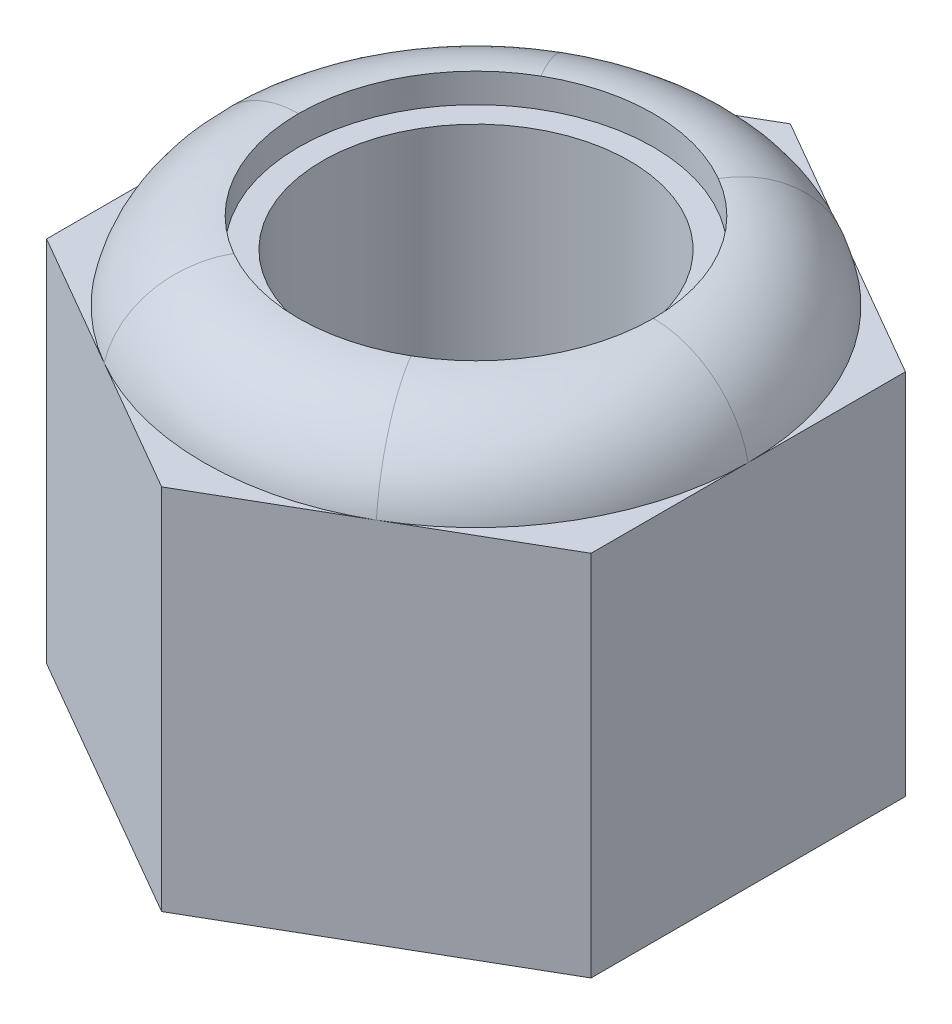
ISO-10303-21;
HEADER;
FILE_DESCRIPTION(('STEP AP214'),'2;1');
FILE_NAME('part.step','',(''),(''),'','','');
FILE_SCHEMA(('AUTOMOTIVE_DESIGN { 1 0 10303 214 1 1 1 1 }'));
ENDSEC;
DATA;
#1=APPLICATION_CONTEXT('core data for automotive mechanical design processes');
#2=APPLICATION_PROTOCOL_DEFINITION('international standard','automotive_design',2000,#1);
#3=PRODUCT_CONTEXT('',#1,'mechanical');
#4=PRODUCT('Part','Part','',(#3));
#5=PRODUCT_RELATED_PRODUCT_CATEGORY('part','',(#4));
#6=PRODUCT_DEFINITION_FORMATION('','',#4);
#7=PRODUCT_DEFINITION_CONTEXT('part definition',#1,'design');
#8=PRODUCT_DEFINITION('design','',#6,#7);
#9=PRODUCT_DEFINITION_SHAPE('','',#8);
#10=(LENGTH_UNIT() NAMED_UNIT(*) SI_UNIT(.MILLI.,.METRE.));
#11=(NAMED_UNIT(*) PLANE_ANGLE_UNIT() SI_UNIT($,.RADIAN.));
#12=(NAMED_UNIT(*) SI_UNIT($,.STERADIAN.) SOLID_ANGLE_UNIT());
#13=UNCERTAINTY_MEASURE_WITH_UNIT(LENGTH_MEASURE(1.E-05),#10,'distance_accuracy_value','');
#14=(GEOMETRIC_REPRESENTATION_CONTEXT(3) GLOBAL_UNCERTAINTY_ASSIGNED_CONTEXT((#13)) GLOBAL_UNIT_ASSIGNED_CONTEXT((#10,
#11,#12)) REPRESENTATION_CONTEXT('',''));
#15=CARTESIAN_POINT('',(0.,0.,0.));
#16=DIRECTION('',(0.,0.,1.));
#17=DIRECTION('',(1.,0.,0.));
#18=AXIS2_PLACEMENT_3D('',#15,#16,#17);
#19=CARTESIAN_POINT('',(0.,9.652,0.));
#20=DIRECTION('',(0.,-1.,0.));
#21=DIRECTION('',(0.,0.,-1.));
#22=AXIS2_PLACEMENT_3D('',#19,#20,#21);
#23=CYLINDRICAL_SURFACE('',#22,4.0291118051323);
#24=CARTESIAN_POINT('',(0.,0.,0.));
#25=DIRECTION('',(0.,1.,0.));
#26=DIRECTION('',(0.,0.,1.));
#27=AXIS2_PLACEMENT_3D('',#24,#25,#26);
#28=CIRCLE('',#27,4.0291118051323);
#29=CARTESIAN_POINT('',(0.,0.,4.0291118051323));
#30=VERTEX_POINT('',#29);
#31=EDGE_CURVE('E188',#30,#30,#28,.T.);
#32=ORIENTED_EDGE('',*,*,#31,.F.);
#33=EDGE_LOOP('',(#32));
#34=FACE_BOUND('',#33,.T.);
#35=CARTESIAN_POINT('',(0.,10.922,0.));
#36=DIRECTION('',(0.,1.,0.));
#37=DIRECTION('',(0.,0.,1.));
#38=AXIS2_PLACEMENT_3D('',#35,#36,#37);
#39=CIRCLE('',#38,4.0291118051323);
#40=CARTESIAN_POINT('',(0.,10.922,4.0291118051323));
#41=VERTEX_POINT('',#40);
#42=EDGE_CURVE('E45',#41,#41,#39,.T.);
#43=ORIENTED_EDGE('',*,*,#42,.T.);
#44=EDGE_LOOP('',(#43));
#45=FACE_BOUND('',#44,.T.);
#46=ADVANCED_FACE('F41',(#34,#45),#23,.F.);
#47=CARTESIAN_POINT('',(0.,9.652,0.));
#48=DIRECTION('',(0.,1.,0.));
#49=DIRECTION('',(0.,0.,1.));
#50=AXIS2_PLACEMENT_3D('',#47,#48,#49);
#51=PLANE('',#50);
#52=CARTESIAN_POINT('',(0.,9.652,0.));
#53=DIRECTION('',(0.,1.,0.));
#54=DIRECTION('',(0.,0.,1.));
#55=AXIS2_PLACEMENT_3D('',#52,#53,#54);
#56=CIRCLE('',#55,7.14375000000001);
#57=CARTESIAN_POINT('',(3.571875,9.652,6.1866689782851));
#58=VERTEX_POINT('',#57);
#59=CARTESIAN_POINT('',(7.14375,9.652,0.));
#60=VERTEX_POINT('',#59);
#61=EDGE_CURVE('E151',#58,#60,#56,.T.);
#62=ORIENTED_EDGE('',*,*,#61,.F.);
#63=DIRECTION('',(0.866025403784439,0.,-0.499999999999999));
#64=VECTOR('',#63,1.);
#65=CARTESIAN_POINT('',(3.571875,9.652,6.18666897828509));
#66=LINE('',#65,#64);
#67=CARTESIAN_POINT('',(7.14374999999999,9.652,4.1244459855234));
#68=VERTEX_POINT('',#67);
#69=EDGE_CURVE('E204',#58,#68,#66,.T.);
#70=ORIENTED_EDGE('',*,*,#69,.T.);
#71=DIRECTION('',(0.,0.,-1.));
#72=VECTOR('',#71,1.);
#73=CARTESIAN_POINT('',(7.14374999999999,9.652,4.1244459855234));
#74=LINE('',#73,#72);
#75=EDGE_CURVE('E208',#68,#60,#74,.T.);
#76=ORIENTED_EDGE('',*,*,#75,.T.);
#77=EDGE_LOOP('',(#62,#70,#76));
#78=FACE_BOUND('',#77,.T.);
#79=ADVANCED_FACE('F296',(#78),#51,.T.);
#80=CARTESIAN_POINT('',(3.571875,9.652,-6.18666897828509));
#81=VERTEX_POINT('',#80);
#82=EDGE_CURVE('E159',#60,#81,#56,.T.);
#83=ORIENTED_EDGE('',*,*,#82,.F.);
#84=CARTESIAN_POINT('',(7.14374999999999,9.652,-4.1244459855234));
#85=VERTEX_POINT('',#84);
#86=EDGE_CURVE('E207',#60,#85,#74,.T.);
#87=ORIENTED_EDGE('',*,*,#86,.T.);
#88=DIRECTION('',(-0.866025403784439,0.,-0.5));
#89=VECTOR('',#88,1.);
#90=CARTESIAN_POINT('',(0.,9.652,-8.24889197104679));
#91=LINE('',#90,#89);
#92=EDGE_CURVE('E212',#85,#81,#91,.T.);
#93=ORIENTED_EDGE('',*,*,#92,.T.);
#94=EDGE_LOOP('',(#83,#87,#93));
#95=FACE_BOUND('',#94,.T.);
#96=ADVANCED_FACE('F289',(#95),#51,.T.);
#97=CARTESIAN_POINT('',(-3.571875,9.652,-6.18666897828509));
#98=VERTEX_POINT('',#97);
#99=EDGE_CURVE('E184',#81,#98,#56,.T.);
#100=ORIENTED_EDGE('',*,*,#99,.F.);
#101=CARTESIAN_POINT('',(0.,9.652,-8.24889197104679));
#102=VERTEX_POINT('',#101);
#103=EDGE_CURVE('E211',#81,#102,#91,.T.);
#104=ORIENTED_EDGE('',*,*,#103,.T.);
#105=DIRECTION('',(-0.866025403784439,0.,0.5));
#106=VECTOR('',#105,1.);
#107=CARTESIAN_POINT('',(-3.571875,9.652,-6.18666897828509));
#108=LINE('',#107,#106);
#109=EDGE_CURVE('E193',#102,#98,#108,.T.);
#110=ORIENTED_EDGE('',*,*,#109,.T.);
#111=EDGE_LOOP('',(#100,#104,#110));
#112=FACE_BOUND('',#111,.T.);
#113=ADVANCED_FACE('F299',(#112),#51,.T.);
#114=CARTESIAN_POINT('',(-7.14375000000001,9.652,0.));
#115=VERTEX_POINT('',#114);
#116=EDGE_CURVE('E182',#98,#115,#56,.T.);
#117=ORIENTED_EDGE('',*,*,#116,.F.);
#118=CARTESIAN_POINT('',(-7.14375000000001,9.652,-4.12444598552339));
#119=VERTEX_POINT('',#118);
#120=EDGE_CURVE('E197',#98,#119,#108,.T.);
#121=ORIENTED_EDGE('',*,*,#120,.T.);
#122=DIRECTION('',(0.,0.,1.));
#123=VECTOR('',#122,1.);
#124=CARTESIAN_POINT('',(-7.14375000000001,9.652,-4.12444598552339));
#125=LINE('',#124,#123);
#126=EDGE_CURVE('E198',#119,#115,#125,.T.);
#127=ORIENTED_EDGE('',*,*,#126,.T.);
#128=EDGE_LOOP('',(#117,#121,#127));
#129=FACE_BOUND('',#128,.T.);
#130=ADVANCED_FACE('F276',(#129),#51,.T.);
#131=CARTESIAN_POINT('',(-3.57187500000001,9.652,6.18666897828509));
#132=VERTEX_POINT('',#131);
#133=EDGE_CURVE('E177',#115,#132,#56,.T.);
#134=ORIENTED_EDGE('',*,*,#133,.F.);
#135=CARTESIAN_POINT('',(-7.14375000000001,9.652,4.12444598552339));
#136=VERTEX_POINT('',#135);
#137=EDGE_CURVE('E196',#115,#136,#125,.T.);
#138=ORIENTED_EDGE('',*,*,#137,.T.);
#139=DIRECTION('',(0.866025403784438,0.,0.5));
#140=VECTOR('',#139,1.);
#141=CARTESIAN_POINT('',(0.,9.652,8.24889197104679));
#142=LINE('',#141,#140);
#143=EDGE_CURVE('E202',#136,#132,#142,.T.);
#144=ORIENTED_EDGE('',*,*,#143,.T.);
#145=EDGE_LOOP('',(#134,#138,#144));
#146=FACE_BOUND('',#145,.T.);
#147=ADVANCED_FACE('F274',(#146),#51,.T.);
#148=EDGE_CURVE('E147',#132,#58,#56,.T.);
#149=ORIENTED_EDGE('',*,*,#148,.F.);
#150=CARTESIAN_POINT('',(0.,9.652,8.24889197104679));
#151=VERTEX_POINT('',#150);
#152=EDGE_CURVE('E201',#132,#151,#142,.T.);
#153=ORIENTED_EDGE('',*,*,#152,.T.);
#154=EDGE_CURVE('E205',#151,#58,#66,.T.);
#155=ORIENTED_EDGE('',*,*,#154,.T.);
#156=EDGE_LOOP('',(#149,#153,#155));
#157=FACE_BOUND('',#156,.T.);
#158=ADVANCED_FACE('F273',(#157),#51,.T.);
#159=CARTESIAN_POINT('',(0.,0.,0.));
#160=DIRECTION('',(0.,1.,0.));
#161=DIRECTION('',(0.,0.,1.));
#162=AXIS2_PLACEMENT_3D('',#159,#160,#161);
#163=PLANE('',#162);
#164=DIRECTION('',(0.,0.,1.));
#165=VECTOR('',#164,1.);
#166=CARTESIAN_POINT('',(-7.14375000000001,0.,4.12444598552339));
#167=LINE('',#166,#165);
#168=CARTESIAN_POINT('',(-7.14375000000001,0.,-4.12444598552339));
#169=VERTEX_POINT('',#168);
#170=CARTESIAN_POINT('',(-7.14375000000001,0.,4.12444598552339));
#171=VERTEX_POINT('',#170);
#172=EDGE_CURVE('E192',#169,#171,#167,.T.);
#173=ORIENTED_EDGE('',*,*,#172,.F.);
#174=DIRECTION('',(-0.866025403784439,0.,0.5));
#175=VECTOR('',#174,1.);
#176=CARTESIAN_POINT('',(-3.571875,0.,-6.18666897828509));
#177=LINE('',#176,#175);
#178=CARTESIAN_POINT('',(0.,0.,-8.24889197104679));
#179=VERTEX_POINT('',#178);
#180=EDGE_CURVE('E227',#179,#169,#177,.T.);
#181=ORIENTED_EDGE('',*,*,#180,.F.);
#182=DIRECTION('',(-0.866025403784439,0.,-0.5));
#183=VECTOR('',#182,1.);
#184=CARTESIAN_POINT('',(0.,0.,-8.24889197104679));
#185=LINE('',#184,#183);
#186=CARTESIAN_POINT('',(7.14374999999999,0.,-4.1244459855234));
#187=VERTEX_POINT('',#186);
#188=EDGE_CURVE('E225',#187,#179,#185,.T.);
#189=ORIENTED_EDGE('',*,*,#188,.F.);
#190=DIRECTION('',(0.,0.,-1.));
#191=VECTOR('',#190,1.);
#192=CARTESIAN_POINT('',(7.14374999999999,0.,-4.1244459855234));
#193=LINE('',#192,#191);
#194=CARTESIAN_POINT('',(7.14374999999999,0.,4.1244459855234));
#195=VERTEX_POINT('',#194);
#196=EDGE_CURVE('E223',#195,#187,#193,.T.);
#197=ORIENTED_EDGE('',*,*,#196,.F.);
#198=DIRECTION('',(0.866025403784439,0.,-0.5));
#199=VECTOR('',#198,1.);
#200=CARTESIAN_POINT('',(3.571875,0.,6.18666897828509));
#201=LINE('',#200,#199);
#202=CARTESIAN_POINT('',(0.,0.,8.24889197104679));
#203=VERTEX_POINT('',#202);
#204=EDGE_CURVE('E220',#203,#195,#201,.T.);
#205=ORIENTED_EDGE('',*,*,#204,.F.);
#206=DIRECTION('',(0.866025403784438,0.,0.5));
#207=VECTOR('',#206,1.);
#208=CARTESIAN_POINT('',(0.,0.,8.24889197104679));
#209=LINE('',#208,#207);
#210=EDGE_CURVE('E217',#171,#203,#209,.T.);
#211=ORIENTED_EDGE('',*,*,#210,.F.);
#212=EDGE_LOOP('',(#173,#181,#189,#197,#205,#211));
#213=FACE_BOUND('',#212,.T.);
#214=ORIENTED_EDGE('',*,*,#31,.T.);
#215=EDGE_LOOP('',(#214));
#216=FACE_BOUND('',#215,.T.);
#217=ADVANCED_FACE('F258',(#213,#216),#163,.F.);
#218=CARTESIAN_POINT('',(-7.14375000000001,9.652,4.12444598552339));
#219=DIRECTION('',(1.,0.,0.));
#220=DIRECTION('',(0.,0.,-1.));
#221=AXIS2_PLACEMENT_3D('',#218,#219,#220);
#222=PLANE('',#221);
#223=ORIENTED_EDGE('',*,*,#172,.T.);
#224=DIRECTION('',(0.,-1.,0.));
#225=VECTOR('',#224,1.);
#226=CARTESIAN_POINT('',(-7.14375000000001,9.652,4.12444598552339));
#227=LINE('',#226,#225);
#228=EDGE_CURVE('E242',#136,#171,#227,.T.);
#229=ORIENTED_EDGE('',*,*,#228,.F.);
#230=ORIENTED_EDGE('',*,*,#137,.F.);
#231=ORIENTED_EDGE('',*,*,#126,.F.);
#232=DIRECTION('',(0.,-1.,0.));
#233=VECTOR('',#232,1.);
#234=CARTESIAN_POINT('',(-7.14375000000001,9.652,-4.12444598552339));
#235=LINE('',#234,#233);
#236=EDGE_CURVE('E185',#119,#169,#235,.T.);
#237=ORIENTED_EDGE('',*,*,#236,.T.);
#238=EDGE_LOOP('',(#223,#229,#230,#231,#237));
#239=FACE_BOUND('',#238,.T.);
#240=ADVANCED_FACE('F248',(#239),#222,.F.);
#241=CARTESIAN_POINT('',(0.,9.652,8.24889197104679));
#242=DIRECTION('',(0.5,0.,-0.866025403784438));
#243=DIRECTION('',(-0.866025403784439,0.,-0.5));
#244=AXIS2_PLACEMENT_3D('',#241,#242,#243);
#245=PLANE('',#244);
#246=ORIENTED_EDGE('',*,*,#210,.T.);
#247=DIRECTION('',(0.,-1.,0.));
#248=VECTOR('',#247,1.);
#249=CARTESIAN_POINT('',(0.,9.652,8.24889197104679));
#250=LINE('',#249,#248);
#251=EDGE_CURVE('E239',#151,#203,#250,.T.);
#252=ORIENTED_EDGE('',*,*,#251,.F.);
#253=ORIENTED_EDGE('',*,*,#152,.F.);
#254=ORIENTED_EDGE('',*,*,#143,.F.);
#255=ORIENTED_EDGE('',*,*,#228,.T.);
#256=EDGE_LOOP('',(#246,#252,#253,#254,#255));
#257=FACE_BOUND('',#256,.T.);
#258=ADVANCED_FACE('F263',(#257),#245,.F.);
#259=CARTESIAN_POINT('',(3.571875,9.652,6.18666897828509));
#260=DIRECTION('',(-0.5,0.,-0.866025403784439));
#261=DIRECTION('',(-0.866025403784439,0.,0.5));
#262=AXIS2_PLACEMENT_3D('',#259,#260,#261);
#263=PLANE('',#262);
#264=ORIENTED_EDGE('',*,*,#204,.T.);
#265=DIRECTION('',(0.,-1.,0.));
#266=VECTOR('',#265,1.);
#267=CARTESIAN_POINT('',(7.14374999999999,9.652,4.1244459855234));
#268=LINE('',#267,#266);
#269=EDGE_CURVE('E236',#68,#195,#268,.T.);
#270=ORIENTED_EDGE('',*,*,#269,.F.);
#271=ORIENTED_EDGE('',*,*,#69,.F.);
#272=ORIENTED_EDGE('',*,*,#154,.F.);
#273=ORIENTED_EDGE('',*,*,#251,.T.);
#274=EDGE_LOOP('',(#264,#270,#271,#272,#273));
#275=FACE_BOUND('',#274,.T.);
#276=ADVANCED_FACE('F268',(#275),#263,.F.);
#277=CARTESIAN_POINT('',(7.14374999999999,9.652,-4.1244459855234));
#278=DIRECTION('',(-1.,0.,0.));
#279=DIRECTION('',(0.,0.,1.));
#280=AXIS2_PLACEMENT_3D('',#277,#278,#279);
#281=PLANE('',#280);
#282=ORIENTED_EDGE('',*,*,#196,.T.);
#283=DIRECTION('',(0.,-1.,0.));
#284=VECTOR('',#283,1.);
#285=CARTESIAN_POINT('',(7.14374999999999,9.652,-4.1244459855234));
#286=LINE('',#285,#284);
#287=EDGE_CURVE('E232',#85,#187,#286,.T.);
#288=ORIENTED_EDGE('',*,*,#287,.F.);
#289=ORIENTED_EDGE('',*,*,#86,.F.);
#290=ORIENTED_EDGE('',*,*,#75,.F.);
#291=ORIENTED_EDGE('',*,*,#269,.T.);
#292=EDGE_LOOP('',(#282,#288,#289,#290,#291));
#293=FACE_BOUND('',#292,.T.);
#294=ADVANCED_FACE('F294',(#293),#281,.F.);
#295=CARTESIAN_POINT('',(0.,9.652,-8.24889197104679));
#296=DIRECTION('',(-0.5,0.,0.866025403784439));
#297=DIRECTION('',(0.866025403784439,0.,0.5));
#298=AXIS2_PLACEMENT_3D('',#295,#296,#297);
#299=PLANE('',#298);
#300=ORIENTED_EDGE('',*,*,#188,.T.);
#301=DIRECTION('',(0.,-1.,0.));
#302=VECTOR('',#301,1.);
#303=CARTESIAN_POINT('',(0.,9.652,-8.24889197104679));
#304=LINE('',#303,#302);
#305=EDGE_CURVE('E215',#102,#179,#304,.T.);
#306=ORIENTED_EDGE('',*,*,#305,.F.);
#307=ORIENTED_EDGE('',*,*,#103,.F.);
#308=ORIENTED_EDGE('',*,*,#92,.F.);
#309=ORIENTED_EDGE('',*,*,#287,.T.);
#310=EDGE_LOOP('',(#300,#306,#307,#308,#309));
#311=FACE_BOUND('',#310,.T.);
#312=ADVANCED_FACE('F298',(#311),#299,.F.);
#313=CARTESIAN_POINT('',(-3.571875,9.652,-6.18666897828509));
#314=DIRECTION('',(0.5,0.,0.866025403784439));
#315=DIRECTION('',(0.866025403784439,0.,-0.5));
#316=AXIS2_PLACEMENT_3D('',#313,#314,#315);
#317=PLANE('',#316);
#318=ORIENTED_EDGE('',*,*,#180,.T.);
#319=ORIENTED_EDGE('',*,*,#236,.F.);
#320=ORIENTED_EDGE('',*,*,#120,.F.);
#321=ORIENTED_EDGE('',*,*,#109,.F.);
#322=ORIENTED_EDGE('',*,*,#305,.T.);
#323=EDGE_LOOP('',(#318,#319,#320,#321,#322));
#324=FACE_BOUND('',#323,.T.);
#325=ADVANCED_FACE('F252',(#324),#317,.F.);
#326=CARTESIAN_POINT('',(0.,9.144,0.));
#327=DIRECTION('',(0.,-1.,0.));
#328=DIRECTION('',(0.,0.,-1.));
#329=AXIS2_PLACEMENT_3D('',#326,#327,#328);
#330=TOROIDAL_SURFACE('',#329,4.6550684213323,2.54);
#331=CARTESIAN_POINT('',(-2.32753421066615,9.144,4.0314075092285));
#332=DIRECTION('',(-0.866025403784439,0.,-0.5));
#333=DIRECTION('',(-0.5,0.,0.866025403784438));
#334=AXIS2_PLACEMENT_3D('',#331,#332,#333);
#335=CIRCLE('',#334,2.54);
#336=CARTESIAN_POINT('',(-2.32753421066615,11.684,4.03140750922849));
#337=VERTEX_POINT('',#336);
#338=EDGE_CURVE('E152',#132,#337,#335,.T.);
#339=ORIENTED_EDGE('',*,*,#338,.F.);
#340=ORIENTED_EDGE('',*,*,#148,.T.);
#341=CARTESIAN_POINT('',(2.32753421066615,9.144,4.0314075092285));
#342=DIRECTION('',(0.866025403784439,0.,-0.499999999999999));
#343=DIRECTION('',(-0.499999999999999,0.,-0.866025403784439));
#344=AXIS2_PLACEMENT_3D('',#341,#342,#343);
#345=CIRCLE('',#344,2.54);
#346=CARTESIAN_POINT('',(2.32753421066614,11.684,4.03140750922849));
#347=VERTEX_POINT('',#346);
#348=EDGE_CURVE('E146',#347,#58,#345,.T.);
#349=ORIENTED_EDGE('',*,*,#348,.F.);
#350=CARTESIAN_POINT('',(0.,11.684,0.));
#351=DIRECTION('',(0.,1.,0.));
#352=DIRECTION('',(0.,0.,1.));
#353=AXIS2_PLACEMENT_3D('',#350,#351,#352);
#354=CIRCLE('',#353,4.6550684213323);
#355=EDGE_CURVE('E131',#337,#347,#354,.T.);
#356=ORIENTED_EDGE('',*,*,#355,.F.);
#357=EDGE_LOOP('',(#339,#340,#349,#356));
#358=FACE_BOUND('',#357,.T.);
#359=ADVANCED_FACE('F43',(#358),#330,.T.);
#360=CARTESIAN_POINT('',(0.,9.144,0.));
#361=DIRECTION('',(0.,-1.,0.));
#362=DIRECTION('',(0.,0.,-1.));
#363=AXIS2_PLACEMENT_3D('',#360,#361,#362);
#364=TOROIDAL_SURFACE('',#363,4.6550684213323,2.54);
#365=ORIENTED_EDGE('',*,*,#348,.T.);
#366=ORIENTED_EDGE('',*,*,#61,.T.);
#367=CARTESIAN_POINT('',(4.65506842133229,9.144,0.));
#368=DIRECTION('',(0.,0.,-1.));
#369=DIRECTION('',(-1.,0.,0.));
#370=AXIS2_PLACEMENT_3D('',#367,#368,#369);
#371=CIRCLE('',#370,2.54);
#372=CARTESIAN_POINT('',(4.6550684213323,11.684,0.));
#373=VERTEX_POINT('',#372);
#374=EDGE_CURVE('E155',#373,#60,#371,.T.);
#375=ORIENTED_EDGE('',*,*,#374,.F.);
#376=CARTESIAN_POINT('',(0.,11.684,0.));
#377=DIRECTION('',(0.,1.,0.));
#378=DIRECTION('',(0.,0.,1.));
#379=AXIS2_PLACEMENT_3D('',#376,#377,#378);
#380=CIRCLE('',#379,4.6550684213323);
#381=EDGE_CURVE('E135',#347,#373,#380,.T.);
#382=ORIENTED_EDGE('',*,*,#381,.F.);
#383=EDGE_LOOP('',(#365,#366,#375,#382));
#384=FACE_BOUND('',#383,.T.);
#385=ADVANCED_FACE('F153',(#384),#364,.T.);
#386=CARTESIAN_POINT('',(0.,9.144,0.));
#387=DIRECTION('',(0.,-1.,0.));
#388=DIRECTION('',(0.,0.,-1.));
#389=AXIS2_PLACEMENT_3D('',#386,#387,#388);
#390=TOROIDAL_SURFACE('',#389,4.6550684213323,2.54);
#391=ORIENTED_EDGE('',*,*,#338,.T.);
#392=CARTESIAN_POINT('',(0.,11.684,0.));
#393=DIRECTION('',(0.,1.,0.));
#394=DIRECTION('',(0.,0.,1.));
#395=AXIS2_PLACEMENT_3D('',#392,#393,#394);
#396=CIRCLE('',#395,4.6550684213323);
#397=CARTESIAN_POINT('',(-4.6550684213323,11.684,0.));
#398=VERTEX_POINT('',#397);
#399=EDGE_CURVE('E138',#398,#337,#396,.T.);
#400=ORIENTED_EDGE('',*,*,#399,.F.);
#401=CARTESIAN_POINT('',(-4.6550684213323,9.144,0.));
#402=DIRECTION('',(0.,0.,-1.));
#403=DIRECTION('',(-1.,0.,0.));
#404=AXIS2_PLACEMENT_3D('',#401,#402,#403);
#405=CIRCLE('',#404,2.54);
#406=EDGE_CURVE('E169',#115,#398,#405,.T.);
#407=ORIENTED_EDGE('',*,*,#406,.F.);
#408=ORIENTED_EDGE('',*,*,#133,.T.);
#409=EDGE_LOOP('',(#391,#400,#407,#408));
#410=FACE_BOUND('',#409,.T.);
#411=ADVANCED_FACE('F175',(#410),#390,.T.);
#412=CARTESIAN_POINT('',(0.,9.144,0.));
#413=DIRECTION('',(0.,-1.,0.));
#414=DIRECTION('',(0.,0.,-1.));
#415=AXIS2_PLACEMENT_3D('',#412,#413,#414);
#416=TOROIDAL_SURFACE('',#415,4.6550684213323,2.54);
#417=ORIENTED_EDGE('',*,*,#374,.T.);
#418=ORIENTED_EDGE('',*,*,#82,.T.);
#419=CARTESIAN_POINT('',(2.32753421066615,9.144,-4.03140750922849));
#420=DIRECTION('',(-0.866025403784439,0.,-0.5));
#421=DIRECTION('',(-0.5,0.,0.866025403784439));
#422=AXIS2_PLACEMENT_3D('',#419,#420,#421);
#423=CIRCLE('',#422,2.54);
#424=CARTESIAN_POINT('',(2.32753421066615,11.684,-4.03140750922849));
#425=VERTEX_POINT('',#424);
#426=EDGE_CURVE('E64',#425,#81,#423,.T.);
#427=ORIENTED_EDGE('',*,*,#426,.F.);
#428=CARTESIAN_POINT('',(0.,11.684,0.));
#429=DIRECTION('',(0.,1.,0.));
#430=DIRECTION('',(0.,0.,1.));
#431=AXIS2_PLACEMENT_3D('',#428,#429,#430);
#432=CIRCLE('',#431,4.6550684213323);
#433=EDGE_CURVE('E57',#373,#425,#432,.T.);
#434=ORIENTED_EDGE('',*,*,#433,.F.);
#435=EDGE_LOOP('',(#417,#418,#427,#434));
#436=FACE_BOUND('',#435,.T.);
#437=ADVANCED_FACE('F286',(#436),#416,.T.);
#438=CARTESIAN_POINT('',(0.,9.144,0.));
#439=DIRECTION('',(0.,-1.,0.));
#440=DIRECTION('',(0.,0.,-1.));
#441=AXIS2_PLACEMENT_3D('',#438,#439,#440);
#442=TOROIDAL_SURFACE('',#441,4.6550684213323,2.54);
#443=ORIENTED_EDGE('',*,*,#406,.T.);
#444=CARTESIAN_POINT('',(0.,11.684,0.));
#445=DIRECTION('',(0.,1.,0.));
#446=DIRECTION('',(0.,0.,1.));
#447=AXIS2_PLACEMENT_3D('',#444,#445,#446);
#448=CIRCLE('',#447,4.6550684213323);
#449=CARTESIAN_POINT('',(-2.32753421066615,11.684,-4.03140750922849));
#450=VERTEX_POINT('',#449);
#451=EDGE_CURVE('E50',#450,#398,#448,.T.);
#452=ORIENTED_EDGE('',*,*,#451,.F.);
#453=CARTESIAN_POINT('',(-2.32753421066615,9.144,-4.0314075092285));
#454=DIRECTION('',(0.866025403784439,0.,-0.5));
#455=DIRECTION('',(-0.5,0.,-0.866025403784439));
#456=AXIS2_PLACEMENT_3D('',#453,#454,#455);
#457=CIRCLE('',#456,2.54);
#458=EDGE_CURVE('E165',#98,#450,#457,.T.);
#459=ORIENTED_EDGE('',*,*,#458,.F.);
#460=ORIENTED_EDGE('',*,*,#116,.T.);
#461=EDGE_LOOP('',(#443,#452,#459,#460));
#462=FACE_BOUND('',#461,.T.);
#463=ADVANCED_FACE('F279',(#462),#442,.T.);
#464=CARTESIAN_POINT('',(0.,9.144,0.));
#465=DIRECTION('',(0.,-1.,0.));
#466=DIRECTION('',(0.,0.,-1.));
#467=AXIS2_PLACEMENT_3D('',#464,#465,#466);
#468=TOROIDAL_SURFACE('',#467,4.6550684213323,2.54);
#469=ORIENTED_EDGE('',*,*,#426,.T.);
#470=ORIENTED_EDGE('',*,*,#99,.T.);
#471=ORIENTED_EDGE('',*,*,#458,.T.);
#472=CARTESIAN_POINT('',(0.,11.684,0.));
#473=DIRECTION('',(0.,1.,0.));
#474=DIRECTION('',(0.,0.,1.));
#475=AXIS2_PLACEMENT_3D('',#472,#473,#474);
#476=CIRCLE('',#475,4.6550684213323);
#477=EDGE_CURVE('E11',#425,#450,#476,.T.);
#478=ORIENTED_EDGE('',*,*,#477,.F.);
#479=EDGE_LOOP('',(#469,#470,#471,#478));
#480=FACE_BOUND('',#479,.T.);
#481=ADVANCED_FACE('F281',(#480),#468,.T.);
#482=CARTESIAN_POINT('',(0.,10.922,0.));
#483=DIRECTION('',(0.,1.,0.));
#484=DIRECTION('',(0.,0.,1.));
#485=AXIS2_PLACEMENT_3D('',#482,#483,#484);
#486=CYLINDRICAL_SURFACE('',#485,4.6550684213323);
#487=CARTESIAN_POINT('',(0.,10.922,0.));
#488=DIRECTION('',(0.,1.,0.));
#489=DIRECTION('',(0.,0.,1.));
#490=AXIS2_PLACEMENT_3D('',#487,#488,#489);
#491=CIRCLE('',#490,4.6550684213323);
#492=CARTESIAN_POINT('',(0.,10.922,4.6550684213323));
#493=VERTEX_POINT('',#492);
#494=EDGE_CURVE('E189',#493,#493,#491,.T.);
#495=ORIENTED_EDGE('',*,*,#494,.F.);
#496=EDGE_LOOP('',(#495));
#497=FACE_BOUND('',#496,.T.);
#498=ORIENTED_EDGE('',*,*,#381,.T.);
#499=ORIENTED_EDGE('',*,*,#433,.T.);
#500=ORIENTED_EDGE('',*,*,#477,.T.);
#501=ORIENTED_EDGE('',*,*,#451,.T.);
#502=ORIENTED_EDGE('',*,*,#399,.T.);
#503=ORIENTED_EDGE('',*,*,#355,.T.);
#504=EDGE_LOOP('',(#498,#499,#500,#501,#502,#503));
#505=FACE_BOUND('',#504,.T.);
#506=ADVANCED_FACE('F133',(#497,#505),#486,.F.);
#507=CARTESIAN_POINT('',(0.,10.922,0.));
#508=DIRECTION('',(0.,1.,0.));
#509=DIRECTION('',(0.,0.,1.));
#510=AXIS2_PLACEMENT_3D('',#507,#508,#509);
#511=PLANE('',#510);
#512=ORIENTED_EDGE('',*,*,#42,.F.);
#513=EDGE_LOOP('',(#512));
#514=FACE_BOUND('',#513,.T.);
#515=ORIENTED_EDGE('',*,*,#494,.T.);
#516=EDGE_LOOP('',(#515));
#517=FACE_BOUND('',#516,.T.);
#518=ADVANCED_FACE('F319',(#514,#517),#511,.T.);
#519=CLOSED_SHELL('',(#46,#79,#96,#113,#130,#147,#158,#217,#240,#258,#276,#294,#312,#325,#359,
#385,#411,#437,#463,#481,#506,#518));
#520=MANIFOLD_SOLID_BREP('B2',#519);
#521=ADVANCED_BREP_SHAPE_REPRESENTATION('',(#18,#520),#14);
#522=SHAPE_DEFINITION_REPRESENTATION(#9,#521);
ENDSEC;
END-ISO-10303-21;
